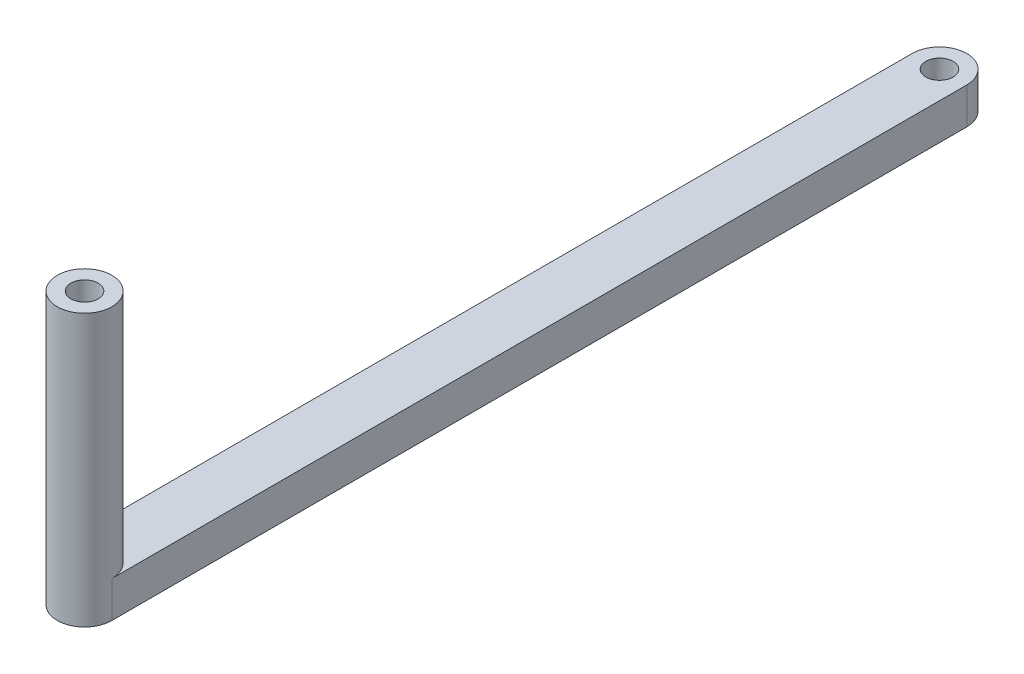
ISO-10303-21;
HEADER;
FILE_DESCRIPTION(('STEP AP214'),'2;1');
FILE_NAME('part.step','',(''),(''),'','','');
FILE_SCHEMA(('AUTOMOTIVE_DESIGN { 1 0 10303 214 1 1 1 1 }'));
ENDSEC;
DATA;
#1=APPLICATION_CONTEXT('core data for automotive mechanical design processes');
#2=APPLICATION_PROTOCOL_DEFINITION('international standard','automotive_design',2000,#1);
#3=PRODUCT_CONTEXT('',#1,'mechanical');
#4=PRODUCT('Part','Part','',(#3));
#5=PRODUCT_RELATED_PRODUCT_CATEGORY('part','',(#4));
#6=PRODUCT_DEFINITION_FORMATION('','',#4);
#7=PRODUCT_DEFINITION_CONTEXT('part definition',#1,'design');
#8=PRODUCT_DEFINITION('design','',#6,#7);
#9=PRODUCT_DEFINITION_SHAPE('','',#8);
#10=(LENGTH_UNIT() NAMED_UNIT(*) SI_UNIT(.MILLI.,.METRE.));
#11=(NAMED_UNIT(*) PLANE_ANGLE_UNIT() SI_UNIT($,.RADIAN.));
#12=(NAMED_UNIT(*) SI_UNIT($,.STERADIAN.) SOLID_ANGLE_UNIT());
#13=UNCERTAINTY_MEASURE_WITH_UNIT(LENGTH_MEASURE(1.E-05),#10,'distance_accuracy_value','');
#14=(GEOMETRIC_REPRESENTATION_CONTEXT(3) GLOBAL_UNCERTAINTY_ASSIGNED_CONTEXT((#13)) GLOBAL_UNIT_ASSIGNED_CONTEXT((#10,
#11,#12)) REPRESENTATION_CONTEXT('',''));
#15=CARTESIAN_POINT('',(0.,0.,0.));
#16=DIRECTION('',(0.,0.,1.));
#17=DIRECTION('',(1.,0.,0.));
#18=AXIS2_PLACEMENT_3D('',#15,#16,#17);
#19=CARTESIAN_POINT('',(1.5,2.,0.));
#20=DIRECTION('',(0.,-1.,0.));
#21=DIRECTION('',(0.,0.,-1.));
#22=AXIS2_PLACEMENT_3D('',#19,#20,#21);
#23=PLANE('',#22);
#24=CARTESIAN_POINT('',(1.49999999999999,2.,-47.));
#25=DIRECTION('',(0.,1.,0.));
#26=DIRECTION('',(0.,0.,1.));
#27=AXIS2_PLACEMENT_3D('',#24,#25,#26);
#28=CIRCLE('',#27,0.750000000000001);
#29=CARTESIAN_POINT('',(1.49999999999999,2.,-46.25));
#30=VERTEX_POINT('',#29);
#31=EDGE_CURVE('E120',#30,#30,#28,.T.);
#32=ORIENTED_EDGE('',*,*,#31,.F.);
#33=EDGE_LOOP('',(#32));
#34=FACE_BOUND('',#33,.T.);
#35=CARTESIAN_POINT('',(1.5,2.,0.));
#36=DIRECTION('',(0.,1.,0.));
#37=DIRECTION('',(0.,0.,1.));
#38=AXIS2_PLACEMENT_3D('',#35,#36,#37);
#39=CIRCLE('',#38,1.50000000000001);
#40=CARTESIAN_POINT('',(3.00000000000001,2.,0.));
#41=VERTEX_POINT('',#40);
#42=CARTESIAN_POINT('',(0.,2.,0.));
#43=VERTEX_POINT('',#42);
#44=EDGE_CURVE('E99',#41,#43,#39,.T.);
#45=ORIENTED_EDGE('',*,*,#44,.F.);
#46=DIRECTION('',(0.,0.,-1.));
#47=VECTOR('',#46,1.);
#48=CARTESIAN_POINT('',(2.99999999999999,2.,-47.));
#49=LINE('',#48,#47);
#50=CARTESIAN_POINT('',(2.99999999999999,2.,-47.));
#51=VERTEX_POINT('',#50);
#52=EDGE_CURVE('E91',#41,#51,#49,.T.);
#53=ORIENTED_EDGE('',*,*,#52,.T.);
#54=CARTESIAN_POINT('',(1.49999999999999,2.,-47.));
#55=DIRECTION('',(0.,1.,0.));
#56=DIRECTION('',(0.,0.,-1.));
#57=AXIS2_PLACEMENT_3D('',#54,#55,#56);
#58=CIRCLE('',#57,1.5);
#59=CARTESIAN_POINT('',(0.,2.,-47.));
#60=VERTEX_POINT('',#59);
#61=EDGE_CURVE('E106',#51,#60,#58,.T.);
#62=ORIENTED_EDGE('',*,*,#61,.T.);
#63=DIRECTION('',(0.,0.,1.));
#64=VECTOR('',#63,1.);
#65=CARTESIAN_POINT('',(0.,2.,0.));
#66=LINE('',#65,#64);
#67=EDGE_CURVE('E64',#60,#43,#66,.T.);
#68=ORIENTED_EDGE('',*,*,#67,.T.);
#69=EDGE_LOOP('',(#45,#53,#62,#68));
#70=FACE_BOUND('',#69,.T.);
#71=ADVANCED_FACE('F46',(#34,#70),#23,.F.);
#72=CARTESIAN_POINT('',(1.5,0.,0.));
#73=DIRECTION('',(0.,-1.,0.));
#74=DIRECTION('',(0.,0.,-1.));
#75=AXIS2_PLACEMENT_3D('',#72,#73,#74);
#76=PLANE('',#75);
#77=CARTESIAN_POINT('',(1.5,0.,0.));
#78=DIRECTION('',(0.,1.,0.));
#79=DIRECTION('',(0.,0.,1.));
#80=AXIS2_PLACEMENT_3D('',#77,#78,#79);
#81=CIRCLE('',#80,0.750000000000001);
#82=CARTESIAN_POINT('',(1.5,0.,0.750000000000001));
#83=VERTEX_POINT('',#82);
#84=EDGE_CURVE('E124',#83,#83,#81,.T.);
#85=ORIENTED_EDGE('',*,*,#84,.T.);
#86=EDGE_LOOP('',(#85));
#87=FACE_BOUND('',#86,.T.);
#88=CARTESIAN_POINT('',(1.5,0.,0.));
#89=DIRECTION('',(0.,1.,0.));
#90=DIRECTION('',(0.,0.,-1.));
#91=AXIS2_PLACEMENT_3D('',#88,#89,#90);
#92=CIRCLE('',#91,1.50000000000001);
#93=CARTESIAN_POINT('',(0.,0.,0.));
#94=VERTEX_POINT('',#93);
#95=CARTESIAN_POINT('',(3.00000000000002,0.,0.));
#96=VERTEX_POINT('',#95);
#97=EDGE_CURVE('E101',#94,#96,#92,.T.);
#98=ORIENTED_EDGE('',*,*,#97,.F.);
#99=DIRECTION('',(0.,0.,1.));
#100=VECTOR('',#99,1.);
#101=CARTESIAN_POINT('',(0.,0.,0.));
#102=LINE('',#101,#100);
#103=CARTESIAN_POINT('',(0.,0.,-47.));
#104=VERTEX_POINT('',#103);
#105=EDGE_CURVE('E87',#104,#94,#102,.T.);
#106=ORIENTED_EDGE('',*,*,#105,.F.);
#107=CARTESIAN_POINT('',(1.49999999999999,0.,-47.));
#108=DIRECTION('',(0.,1.,0.));
#109=DIRECTION('',(0.,0.,-1.));
#110=AXIS2_PLACEMENT_3D('',#107,#108,#109);
#111=CIRCLE('',#110,1.5);
#112=CARTESIAN_POINT('',(2.99999999999999,0.,-47.));
#113=VERTEX_POINT('',#112);
#114=EDGE_CURVE('E82',#113,#104,#111,.T.);
#115=ORIENTED_EDGE('',*,*,#114,.F.);
#116=DIRECTION('',(0.,0.,-1.));
#117=VECTOR('',#116,1.);
#118=CARTESIAN_POINT('',(2.99999999999999,0.,-47.));
#119=LINE('',#118,#117);
#120=EDGE_CURVE('E138',#96,#113,#119,.T.);
#121=ORIENTED_EDGE('',*,*,#120,.F.);
#122=EDGE_LOOP('',(#98,#106,#115,#121));
#123=FACE_BOUND('',#122,.T.);
#124=CARTESIAN_POINT('',(1.49999999999999,0.,-47.));
#125=DIRECTION('',(0.,1.,0.));
#126=DIRECTION('',(0.,0.,1.));
#127=AXIS2_PLACEMENT_3D('',#124,#125,#126);
#128=CIRCLE('',#127,0.750000000000001);
#129=CARTESIAN_POINT('',(1.49999999999999,0.,-46.25));
#130=VERTEX_POINT('',#129);
#131=EDGE_CURVE('E115',#130,#130,#128,.T.);
#132=ORIENTED_EDGE('',*,*,#131,.T.);
#133=EDGE_LOOP('',(#132));
#134=FACE_BOUND('',#133,.T.);
#135=ADVANCED_FACE('F152',(#87,#123,#134),#76,.T.);
#136=CARTESIAN_POINT('',(1.5,2.,0.));
#137=DIRECTION('',(0.,-1.,0.));
#138=DIRECTION('',(0.,0.,-1.));
#139=AXIS2_PLACEMENT_3D('',#136,#137,#138);
#140=CYLINDRICAL_SURFACE('',#139,1.50000000000001);
#141=ORIENTED_EDGE('',*,*,#97,.T.);
#142=DIRECTION('',(0.,-1.,0.));
#143=VECTOR('',#142,1.);
#144=CARTESIAN_POINT('',(3.00000000000002,2.,0.));
#145=LINE('',#144,#143);
#146=EDGE_CURVE('E12',#41,#96,#145,.T.);
#147=ORIENTED_EDGE('',*,*,#146,.F.);
#148=ORIENTED_EDGE('',*,*,#44,.T.);
#149=DIRECTION('',(0.,-1.,0.));
#150=VECTOR('',#149,1.);
#151=CARTESIAN_POINT('',(0.,2.,0.));
#152=LINE('',#151,#150);
#153=EDGE_CURVE('E135',#43,#94,#152,.T.);
#154=ORIENTED_EDGE('',*,*,#153,.T.);
#155=EDGE_LOOP('',(#141,#147,#148,#154));
#156=FACE_BOUND('',#155,.T.);
#157=CARTESIAN_POINT('',(1.5,14.94,0.));
#158=DIRECTION('',(0.,1.,0.));
#159=DIRECTION('',(0.,0.,1.));
#160=AXIS2_PLACEMENT_3D('',#157,#158,#159);
#161=CIRCLE('',#160,1.50000000000001);
#162=CARTESIAN_POINT('',(1.5,14.94,1.50000000000001));
#163=VERTEX_POINT('',#162);
#164=EDGE_CURVE('E109',#163,#163,#161,.T.);
#165=ORIENTED_EDGE('',*,*,#164,.F.);
#166=EDGE_LOOP('',(#165));
#167=FACE_BOUND('',#166,.T.);
#168=ADVANCED_FACE('F48',(#156,#167),#140,.T.);
#169=CARTESIAN_POINT('',(2.99999999999999,2.,-47.));
#170=DIRECTION('',(-1.,0.,0.));
#171=DIRECTION('',(0.,0.,1.));
#172=AXIS2_PLACEMENT_3D('',#169,#170,#171);
#173=PLANE('',#172);
#174=ORIENTED_EDGE('',*,*,#120,.T.);
#175=DIRECTION('',(0.,-1.,0.));
#176=VECTOR('',#175,1.);
#177=CARTESIAN_POINT('',(2.99999999999999,2.,-47.));
#178=LINE('',#177,#176);
#179=EDGE_CURVE('E56',#51,#113,#178,.T.);
#180=ORIENTED_EDGE('',*,*,#179,.F.);
#181=ORIENTED_EDGE('',*,*,#52,.F.);
#182=ORIENTED_EDGE('',*,*,#146,.T.);
#183=EDGE_LOOP('',(#174,#180,#181,#182));
#184=FACE_BOUND('',#183,.T.);
#185=ADVANCED_FACE('F103',(#184),#173,.F.);
#186=CARTESIAN_POINT('',(1.49999999999999,2.,-47.));
#187=DIRECTION('',(0.,-1.,0.));
#188=DIRECTION('',(0.,0.,-1.));
#189=AXIS2_PLACEMENT_3D('',#186,#187,#188);
#190=CYLINDRICAL_SURFACE('',#189,1.5);
#191=ORIENTED_EDGE('',*,*,#114,.T.);
#192=DIRECTION('',(0.,-1.,0.));
#193=VECTOR('',#192,1.);
#194=CARTESIAN_POINT('',(0.,2.,-47.));
#195=LINE('',#194,#193);
#196=EDGE_CURVE('E147',#60,#104,#195,.T.);
#197=ORIENTED_EDGE('',*,*,#196,.F.);
#198=ORIENTED_EDGE('',*,*,#61,.F.);
#199=ORIENTED_EDGE('',*,*,#179,.T.);
#200=EDGE_LOOP('',(#191,#197,#198,#199));
#201=FACE_BOUND('',#200,.T.);
#202=ADVANCED_FACE('F150',(#201),#190,.T.);
#203=CARTESIAN_POINT('',(0.,2.,0.));
#204=DIRECTION('',(1.,0.,0.));
#205=DIRECTION('',(0.,0.,-1.));
#206=AXIS2_PLACEMENT_3D('',#203,#204,#205);
#207=PLANE('',#206);
#208=ORIENTED_EDGE('',*,*,#105,.T.);
#209=ORIENTED_EDGE('',*,*,#153,.F.);
#210=ORIENTED_EDGE('',*,*,#67,.F.);
#211=ORIENTED_EDGE('',*,*,#196,.T.);
#212=EDGE_LOOP('',(#208,#209,#210,#211));
#213=FACE_BOUND('',#212,.T.);
#214=ADVANCED_FACE('F173',(#213),#207,.F.);
#215=CARTESIAN_POINT('',(1.5,2.,0.));
#216=DIRECTION('',(0.,-1.,0.));
#217=DIRECTION('',(0.,0.,-1.));
#218=AXIS2_PLACEMENT_3D('',#215,#216,#217);
#219=CYLINDRICAL_SURFACE('',#218,0.750000000000001);
#220=ORIENTED_EDGE('',*,*,#84,.F.);
#221=EDGE_LOOP('',(#220));
#222=FACE_BOUND('',#221,.T.);
#223=CARTESIAN_POINT('',(1.5,14.94,0.));
#224=DIRECTION('',(0.,1.,0.));
#225=DIRECTION('',(0.,0.,1.));
#226=AXIS2_PLACEMENT_3D('',#223,#224,#225);
#227=CIRCLE('',#226,0.750000000000001);
#228=CARTESIAN_POINT('',(1.5,14.94,0.750000000000001));
#229=VERTEX_POINT('',#228);
#230=EDGE_CURVE('E110',#229,#229,#227,.T.);
#231=ORIENTED_EDGE('',*,*,#230,.T.);
#232=EDGE_LOOP('',(#231));
#233=FACE_BOUND('',#232,.T.);
#234=ADVANCED_FACE('F162',(#222,#233),#219,.F.);
#235=CARTESIAN_POINT('',(1.49999999999999,2.,-47.));
#236=DIRECTION('',(0.,-1.,0.));
#237=DIRECTION('',(0.,0.,-1.));
#238=AXIS2_PLACEMENT_3D('',#235,#236,#237);
#239=CYLINDRICAL_SURFACE('',#238,0.750000000000001);
#240=ORIENTED_EDGE('',*,*,#31,.T.);
#241=EDGE_LOOP('',(#240));
#242=FACE_BOUND('',#241,.T.);
#243=ORIENTED_EDGE('',*,*,#131,.F.);
#244=EDGE_LOOP('',(#243));
#245=FACE_BOUND('',#244,.T.);
#246=ADVANCED_FACE('F159',(#242,#245),#239,.F.);
#247=CARTESIAN_POINT('',(1.5,14.94,0.));
#248=DIRECTION('',(0.,1.,0.));
#249=DIRECTION('',(0.,0.,1.));
#250=AXIS2_PLACEMENT_3D('',#247,#248,#249);
#251=PLANE('',#250);
#252=ORIENTED_EDGE('',*,*,#164,.T.);
#253=EDGE_LOOP('',(#252));
#254=FACE_BOUND('',#253,.T.);
#255=ORIENTED_EDGE('',*,*,#230,.F.);
#256=EDGE_LOOP('',(#255));
#257=FACE_BOUND('',#256,.T.);
#258=ADVANCED_FACE('F161',(#254,#257),#251,.T.);
#259=CLOSED_SHELL('',(#71,#135,#168,#185,#202,#214,#234,#246,#258));
#260=MANIFOLD_SOLID_BREP('B2',#259);
#261=ADVANCED_BREP_SHAPE_REPRESENTATION('',(#18,#260),#14);
#262=SHAPE_DEFINITION_REPRESENTATION(#9,#261);
ENDSEC;
END-ISO-10303-21;
